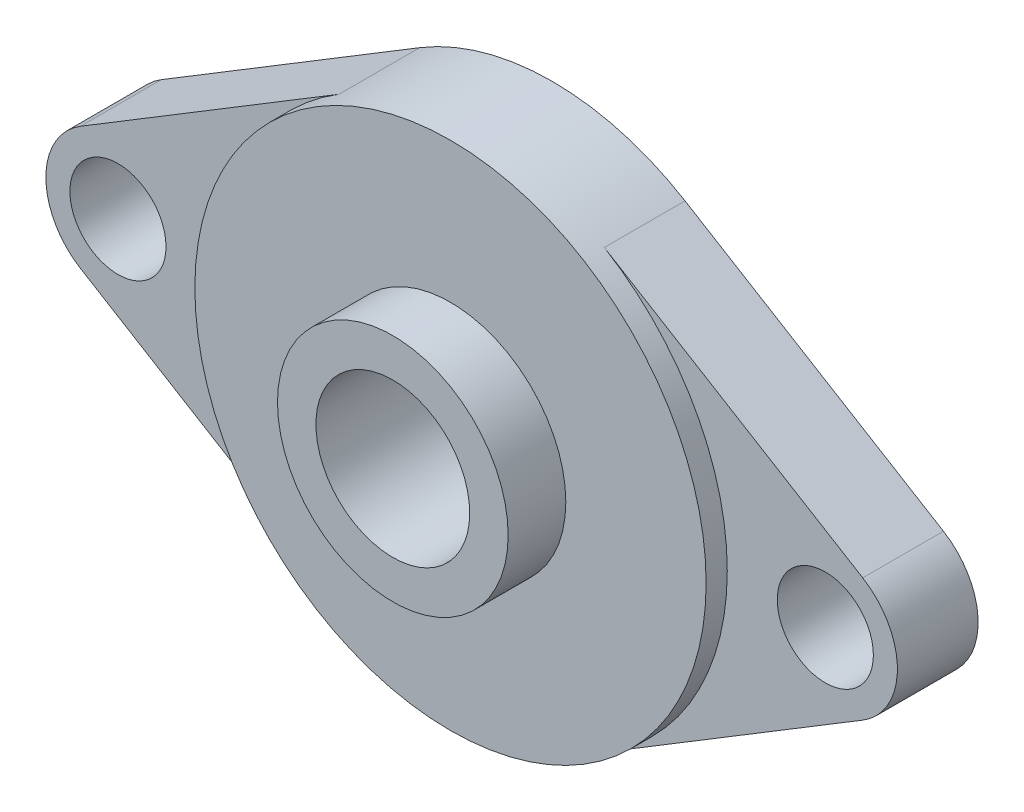
ISO-10303-21;
HEADER;
FILE_DESCRIPTION(('STEP AP214'),'2;1');
FILE_NAME('part.step','',(''),(''),'','','');
FILE_SCHEMA(('AUTOMOTIVE_DESIGN { 1 0 10303 214 1 1 1 1 }'));
ENDSEC;
DATA;
#1=APPLICATION_CONTEXT('core data for automotive mechanical design processes');
#2=APPLICATION_PROTOCOL_DEFINITION('international standard','automotive_design',2000,#1);
#3=PRODUCT_CONTEXT('',#1,'mechanical');
#4=PRODUCT('Part','Part','',(#3));
#5=PRODUCT_RELATED_PRODUCT_CATEGORY('part','',(#4));
#6=PRODUCT_DEFINITION_FORMATION('','',#4);
#7=PRODUCT_DEFINITION_CONTEXT('part definition',#1,'design');
#8=PRODUCT_DEFINITION('design','',#6,#7);
#9=PRODUCT_DEFINITION_SHAPE('','',#8);
#10=(LENGTH_UNIT() NAMED_UNIT(*) SI_UNIT(.MILLI.,.METRE.));
#11=(NAMED_UNIT(*) PLANE_ANGLE_UNIT() SI_UNIT($,.RADIAN.));
#12=(NAMED_UNIT(*) SI_UNIT($,.STERADIAN.) SOLID_ANGLE_UNIT());
#13=UNCERTAINTY_MEASURE_WITH_UNIT(LENGTH_MEASURE(1.E-05),#10,'distance_accuracy_value','');
#14=(GEOMETRIC_REPRESENTATION_CONTEXT(3) GLOBAL_UNCERTAINTY_ASSIGNED_CONTEXT((#13)) GLOBAL_UNIT_ASSIGNED_CONTEXT((#10,
#11,#12)) REPRESENTATION_CONTEXT('',''));
#15=CARTESIAN_POINT('',(0.,0.,0.));
#16=DIRECTION('',(0.,0.,1.));
#17=DIRECTION('',(1.,0.,0.));
#18=AXIS2_PLACEMENT_3D('',#15,#16,#17);
#19=CARTESIAN_POINT('',(0.,0.,4.2));
#20=DIRECTION('',(0.,0.,-1.));
#21=DIRECTION('',(-1.,0.,0.));
#22=AXIS2_PLACEMENT_3D('',#19,#20,#21);
#23=CYLINDRICAL_SURFACE('',#22,13.3);
#24=CARTESIAN_POINT('',(0.,0.,0.));
#25=DIRECTION('',(0.,0.,1.));
#26=DIRECTION('',(1.,0.,0.));
#27=AXIS2_PLACEMENT_3D('',#24,#25,#26);
#28=CIRCLE('',#27,13.3);
#29=CARTESIAN_POINT('',(6.90298913043478,11.3683218227274,0.));
#30=VERTEX_POINT('',#29);
#31=CARTESIAN_POINT('',(-6.90298913043478,11.3683218227274,0.));
#32=VERTEX_POINT('',#31);
#33=EDGE_CURVE('E84',#30,#32,#28,.T.);
#34=ORIENTED_EDGE('',*,*,#33,.T.);
#35=DIRECTION('',(0.,0.,-1.));
#36=VECTOR('',#35,1.);
#37=CARTESIAN_POINT('',(-6.90298913043478,11.3683218227274,4.2));
#38=LINE('',#37,#36);
#39=CARTESIAN_POINT('',(-6.90298913043478,11.3683218227274,4.2));
#40=VERTEX_POINT('',#39);
#41=EDGE_CURVE('E171',#40,#32,#38,.T.);
#42=ORIENTED_EDGE('',*,*,#41,.F.);
#43=CARTESIAN_POINT('',(0.,0.,4.2));
#44=DIRECTION('',(0.,0.,1.));
#45=DIRECTION('',(1.,0.,0.));
#46=AXIS2_PLACEMENT_3D('',#43,#44,#45);
#47=CIRCLE('',#46,13.3);
#48=CARTESIAN_POINT('',(-6.90298913043478,-11.3683218227274,4.2));
#49=VERTEX_POINT('',#48);
#50=EDGE_CURVE('E147',#49,#40,#47,.F.);
#51=ORIENTED_EDGE('',*,*,#50,.F.);
#52=DIRECTION('',(0.,0.,-1.));
#53=VECTOR('',#52,1.);
#54=CARTESIAN_POINT('',(-6.90298913043478,-11.3683218227274,4.2));
#55=LINE('',#54,#53);
#56=CARTESIAN_POINT('',(-6.90298913043478,-11.3683218227274,0.));
#57=VERTEX_POINT('',#56);
#58=EDGE_CURVE('E47',#49,#57,#55,.T.);
#59=ORIENTED_EDGE('',*,*,#58,.T.);
#60=CARTESIAN_POINT('',(6.90298913043478,-11.3683218227274,0.));
#61=VERTEX_POINT('',#60);
#62=EDGE_CURVE('E150',#57,#61,#28,.T.);
#63=ORIENTED_EDGE('',*,*,#62,.T.);
#64=DIRECTION('',(0.,0.,-1.));
#65=VECTOR('',#64,1.);
#66=CARTESIAN_POINT('',(6.90298913043478,-11.3683218227274,4.2));
#67=LINE('',#66,#65);
#68=CARTESIAN_POINT('',(6.90298913043478,-11.3683218227274,4.2));
#69=VERTEX_POINT('',#68);
#70=EDGE_CURVE('E126',#69,#61,#67,.T.);
#71=ORIENTED_EDGE('',*,*,#70,.F.);
#72=CARTESIAN_POINT('',(6.90298913043478,11.3683218227274,4.2));
#73=VERTEX_POINT('',#72);
#74=EDGE_CURVE('E112',#73,#69,#47,.F.);
#75=ORIENTED_EDGE('',*,*,#74,.F.);
#76=DIRECTION('',(0.,0.,-1.));
#77=VECTOR('',#76,1.);
#78=CARTESIAN_POINT('',(6.90298913043478,11.3683218227274,4.2));
#79=LINE('',#78,#77);
#80=EDGE_CURVE('E173',#73,#30,#79,.T.);
#81=ORIENTED_EDGE('',*,*,#80,.T.);
#82=EDGE_LOOP('',(#34,#42,#51,#59,#63,#71,#75,#81));
#83=FACE_BOUND('',#82,.T.);
#84=CARTESIAN_POINT('',(0.,0.,5.3));
#85=DIRECTION('',(0.,0.,1.));
#86=DIRECTION('',(1.,0.,0.));
#87=AXIS2_PLACEMENT_3D('',#84,#85,#86);
#88=CIRCLE('',#87,13.3);
#89=CARTESIAN_POINT('',(13.3,0.,5.3));
#90=VERTEX_POINT('',#89);
#91=EDGE_CURVE('E252',#90,#90,#88,.T.);
#92=ORIENTED_EDGE('',*,*,#91,.F.);
#93=EDGE_LOOP('',(#92));
#94=FACE_BOUND('',#93,.T.);
#95=ADVANCED_FACE('F38',(#83,#94),#23,.T.);
#96=CARTESIAN_POINT('',(0.,0.,8.3));
#97=DIRECTION('',(0.,0.,1.));
#98=DIRECTION('',(1.,0.,0.));
#99=AXIS2_PLACEMENT_3D('',#96,#97,#98);
#100=PLANE('',#99);
#101=CARTESIAN_POINT('',(0.,0.,8.3));
#102=DIRECTION('',(0.,0.,1.));
#103=DIRECTION('',(1.,0.,0.));
#104=AXIS2_PLACEMENT_3D('',#101,#102,#103);
#105=CIRCLE('',#104,4.);
#106=CARTESIAN_POINT('',(4.,0.,8.3));
#107=VERTEX_POINT('',#106);
#108=EDGE_CURVE('E196',#107,#107,#105,.T.);
#109=ORIENTED_EDGE('',*,*,#108,.F.);
#110=EDGE_LOOP('',(#109));
#111=FACE_BOUND('',#110,.T.);
#112=CARTESIAN_POINT('',(0.,0.,8.3));
#113=DIRECTION('',(0.,0.,1.));
#114=DIRECTION('',(1.,0.,0.));
#115=AXIS2_PLACEMENT_3D('',#112,#113,#114);
#116=CIRCLE('',#115,6.);
#117=CARTESIAN_POINT('',(6.,0.,8.3));
#118=VERTEX_POINT('',#117);
#119=EDGE_CURVE('E249',#118,#118,#116,.T.);
#120=ORIENTED_EDGE('',*,*,#119,.T.);
#121=EDGE_LOOP('',(#120));
#122=FACE_BOUND('',#121,.T.);
#123=ADVANCED_FACE('F213',(#111,#122),#100,.T.);
#124=CARTESIAN_POINT('',(0.,0.,4.2));
#125=DIRECTION('',(0.,0.,1.));
#126=DIRECTION('',(1.,0.,0.));
#127=AXIS2_PLACEMENT_3D('',#124,#125,#126);
#128=PLANE('',#127);
#129=CARTESIAN_POINT('',(-18.4,0.,4.2));
#130=DIRECTION('',(0.,0.,1.));
#131=DIRECTION('',(1.,0.,0.));
#132=AXIS2_PLACEMENT_3D('',#129,#130,#131);
#133=CIRCLE('',#132,2.5);
#134=CARTESIAN_POINT('',(-15.9,0.,4.2));
#135=VERTEX_POINT('',#134);
#136=EDGE_CURVE('E137',#135,#135,#133,.F.);
#137=ORIENTED_EDGE('',*,*,#136,.T.);
#138=EDGE_LOOP('',(#137));
#139=FACE_BOUND('',#138,.T.);
#140=DIRECTION('',(-0.85476103930281,0.519021739130434,0.));
#141=VECTOR('',#140,1.);
#142=CARTESIAN_POINT('',(-6.90298913043478,-11.3683218227274,4.2));
#143=LINE('',#142,#141);
#144=CARTESIAN_POINT('',(-20.3463315217391,-3.20535389738554,4.2));
#145=VERTEX_POINT('',#144);
#146=EDGE_CURVE('E116',#49,#145,#143,.T.);
#147=ORIENTED_EDGE('',*,*,#146,.F.);
#148=ORIENTED_EDGE('',*,*,#50,.T.);
#149=DIRECTION('',(-0.85476103930281,-0.519021739130434,0.));
#150=VECTOR('',#149,1.);
#151=CARTESIAN_POINT('',(-6.90298913043478,11.3683218227274,4.2));
#152=LINE('',#151,#150);
#153=CARTESIAN_POINT('',(-20.3463315217391,3.20535389738554,4.2));
#154=VERTEX_POINT('',#153);
#155=EDGE_CURVE('E55',#40,#154,#152,.T.);
#156=ORIENTED_EDGE('',*,*,#155,.T.);
#157=CARTESIAN_POINT('',(-18.4,0.,4.2));
#158=DIRECTION('',(0.,0.,1.));
#159=DIRECTION('',(1.,0.,0.));
#160=AXIS2_PLACEMENT_3D('',#157,#158,#159);
#161=CIRCLE('',#160,3.75);
#162=EDGE_CURVE('E169',#145,#154,#161,.F.);
#163=ORIENTED_EDGE('',*,*,#162,.F.);
#164=EDGE_LOOP('',(#147,#148,#156,#163));
#165=FACE_BOUND('',#164,.T.);
#166=ADVANCED_FACE('F217',(#139,#165),#128,.T.);
#167=CARTESIAN_POINT('',(-18.4,0.,4.2));
#168=DIRECTION('',(0.,0.,-1.));
#169=DIRECTION('',(-1.,0.,0.));
#170=AXIS2_PLACEMENT_3D('',#167,#168,#169);
#171=CYLINDRICAL_SURFACE('',#170,3.75);
#172=CARTESIAN_POINT('',(-18.4,0.,0.));
#173=DIRECTION('',(0.,0.,1.));
#174=DIRECTION('',(1.,0.,0.));
#175=AXIS2_PLACEMENT_3D('',#172,#173,#174);
#176=CIRCLE('',#175,3.75);
#177=CARTESIAN_POINT('',(-20.3463315217391,-3.20535389738554,0.));
#178=VERTEX_POINT('',#177);
#179=CARTESIAN_POINT('',(-20.3463315217391,3.20535389738554,0.));
#180=VERTEX_POINT('',#179);
#181=EDGE_CURVE('E143',#178,#180,#176,.F.);
#182=ORIENTED_EDGE('',*,*,#181,.F.);
#183=DIRECTION('',(0.,0.,-1.));
#184=VECTOR('',#183,1.);
#185=CARTESIAN_POINT('',(-20.3463315217391,-3.20535389738554,4.2));
#186=LINE('',#185,#184);
#187=EDGE_CURVE('E11',#145,#178,#186,.T.);
#188=ORIENTED_EDGE('',*,*,#187,.F.);
#189=ORIENTED_EDGE('',*,*,#162,.T.);
#190=DIRECTION('',(0.,0.,-1.));
#191=VECTOR('',#190,1.);
#192=CARTESIAN_POINT('',(-20.3463315217391,3.20535389738554,4.2));
#193=LINE('',#192,#191);
#194=EDGE_CURVE('E91',#154,#180,#193,.T.);
#195=ORIENTED_EDGE('',*,*,#194,.T.);
#196=EDGE_LOOP('',(#182,#188,#189,#195));
#197=FACE_BOUND('',#196,.T.);
#198=ADVANCED_FACE('F40',(#197),#171,.T.);
#199=CARTESIAN_POINT('',(-6.90298913043478,-11.3683218227274,4.2));
#200=DIRECTION('',(-0.519021739130434,-0.85476103930281,0.));
#201=DIRECTION('',(0.85476103930281,-0.519021739130434,0.));
#202=AXIS2_PLACEMENT_3D('',#199,#200,#201);
#203=PLANE('',#202);
#204=DIRECTION('',(-0.85476103930281,0.519021739130434,0.));
#205=VECTOR('',#204,1.);
#206=CARTESIAN_POINT('',(-6.90298913043478,-11.3683218227274,0.));
#207=LINE('',#206,#205);
#208=EDGE_CURVE('E146',#57,#178,#207,.T.);
#209=ORIENTED_EDGE('',*,*,#208,.F.);
#210=ORIENTED_EDGE('',*,*,#58,.F.);
#211=ORIENTED_EDGE('',*,*,#146,.T.);
#212=ORIENTED_EDGE('',*,*,#187,.T.);
#213=EDGE_LOOP('',(#209,#210,#211,#212));
#214=FACE_BOUND('',#213,.T.);
#215=ADVANCED_FACE('F187',(#214),#203,.T.);
#216=CARTESIAN_POINT('',(6.90298913043478,-11.3683218227274,4.2));
#217=DIRECTION('',(-0.519021739130435,0.85476103930281,0.));
#218=DIRECTION('',(-0.854761039302809,-0.519021739130435,0.));
#219=AXIS2_PLACEMENT_3D('',#216,#217,#218);
#220=PLANE('',#219);
#221=DIRECTION('',(0.85476103930281,0.519021739130435,0.));
#222=VECTOR('',#221,1.);
#223=CARTESIAN_POINT('',(6.90298913043478,-11.3683218227274,0.));
#224=LINE('',#223,#222);
#225=CARTESIAN_POINT('',(20.3463315217391,-3.20535389738553,0.));
#226=VERTEX_POINT('',#225);
#227=EDGE_CURVE('E122',#61,#226,#224,.T.);
#228=ORIENTED_EDGE('',*,*,#227,.T.);
#229=DIRECTION('',(0.,0.,-1.));
#230=VECTOR('',#229,1.);
#231=CARTESIAN_POINT('',(20.3463315217391,-3.20535389738553,4.2));
#232=LINE('',#231,#230);
#233=CARTESIAN_POINT('',(20.3463315217391,-3.20535389738553,4.2));
#234=VERTEX_POINT('',#233);
#235=EDGE_CURVE('E119',#234,#226,#232,.T.);
#236=ORIENTED_EDGE('',*,*,#235,.F.);
#237=DIRECTION('',(0.85476103930281,0.519021739130435,0.));
#238=VECTOR('',#237,1.);
#239=CARTESIAN_POINT('',(6.90298913043478,-11.3683218227274,4.2));
#240=LINE('',#239,#238);
#241=EDGE_CURVE('E103',#69,#234,#240,.T.);
#242=ORIENTED_EDGE('',*,*,#241,.F.);
#243=ORIENTED_EDGE('',*,*,#70,.T.);
#244=EDGE_LOOP('',(#228,#236,#242,#243));
#245=FACE_BOUND('',#244,.T.);
#246=ADVANCED_FACE('F120',(#245),#220,.F.);
#247=CARTESIAN_POINT('',(18.4,0.,4.2));
#248=DIRECTION('',(0.,0.,-1.));
#249=DIRECTION('',(-1.,0.,0.));
#250=AXIS2_PLACEMENT_3D('',#247,#248,#249);
#251=CYLINDRICAL_SURFACE('',#250,3.75);
#252=CARTESIAN_POINT('',(18.4,0.,0.));
#253=DIRECTION('',(0.,0.,1.));
#254=DIRECTION('',(1.,0.,0.));
#255=AXIS2_PLACEMENT_3D('',#252,#253,#254);
#256=CIRCLE('',#255,3.75);
#257=CARTESIAN_POINT('',(20.3463315217391,3.20535389738553,0.));
#258=VERTEX_POINT('',#257);
#259=EDGE_CURVE('E153',#226,#258,#256,.T.);
#260=ORIENTED_EDGE('',*,*,#259,.T.);
#261=DIRECTION('',(0.,0.,-1.));
#262=VECTOR('',#261,1.);
#263=CARTESIAN_POINT('',(20.3463315217391,3.20535389738553,4.2));
#264=LINE('',#263,#262);
#265=CARTESIAN_POINT('',(20.3463315217391,3.20535389738553,4.2));
#266=VERTEX_POINT('',#265);
#267=EDGE_CURVE('E127',#266,#258,#264,.T.);
#268=ORIENTED_EDGE('',*,*,#267,.F.);
#269=CARTESIAN_POINT('',(18.4,0.,4.2));
#270=DIRECTION('',(0.,0.,1.));
#271=DIRECTION('',(1.,0.,0.));
#272=AXIS2_PLACEMENT_3D('',#269,#270,#271);
#273=CIRCLE('',#272,3.75);
#274=EDGE_CURVE('E109',#234,#266,#273,.T.);
#275=ORIENTED_EDGE('',*,*,#274,.F.);
#276=ORIENTED_EDGE('',*,*,#235,.T.);
#277=EDGE_LOOP('',(#260,#268,#275,#276));
#278=FACE_BOUND('',#277,.T.);
#279=ADVANCED_FACE('F129',(#278),#251,.T.);
#280=CARTESIAN_POINT('',(6.90298913043478,11.3683218227274,4.2));
#281=DIRECTION('',(0.519021739130435,0.85476103930281,0.));
#282=DIRECTION('',(-0.854761039302809,0.519021739130435,0.));
#283=AXIS2_PLACEMENT_3D('',#280,#281,#282);
#284=PLANE('',#283);
#285=DIRECTION('',(0.85476103930281,-0.519021739130435,0.));
#286=VECTOR('',#285,1.);
#287=CARTESIAN_POINT('',(6.90298913043478,11.3683218227274,0.));
#288=LINE('',#287,#286);
#289=EDGE_CURVE('E155',#30,#258,#288,.T.);
#290=ORIENTED_EDGE('',*,*,#289,.F.);
#291=ORIENTED_EDGE('',*,*,#80,.F.);
#292=DIRECTION('',(0.85476103930281,-0.519021739130435,0.));
#293=VECTOR('',#292,1.);
#294=CARTESIAN_POINT('',(6.90298913043478,11.3683218227274,4.2));
#295=LINE('',#294,#293);
#296=EDGE_CURVE('E131',#73,#266,#295,.T.);
#297=ORIENTED_EDGE('',*,*,#296,.T.);
#298=ORIENTED_EDGE('',*,*,#267,.T.);
#299=EDGE_LOOP('',(#290,#291,#297,#298));
#300=FACE_BOUND('',#299,.T.);
#301=ADVANCED_FACE('F199',(#300),#284,.T.);
#302=CARTESIAN_POINT('',(0.,0.,4.2));
#303=DIRECTION('',(0.,0.,-1.));
#304=DIRECTION('',(-1.,0.,0.));
#305=AXIS2_PLACEMENT_3D('',#302,#303,#304);
#306=CYLINDRICAL_SURFACE('',#305,4.);
#307=CARTESIAN_POINT('',(0.,0.,0.));
#308=DIRECTION('',(0.,0.,1.));
#309=DIRECTION('',(1.,0.,0.));
#310=AXIS2_PLACEMENT_3D('',#307,#308,#309);
#311=CIRCLE('',#310,4.);
#312=CARTESIAN_POINT('',(4.,0.,0.));
#313=VERTEX_POINT('',#312);
#314=EDGE_CURVE('E163',#313,#313,#311,.T.);
#315=ORIENTED_EDGE('',*,*,#314,.F.);
#316=EDGE_LOOP('',(#315));
#317=FACE_BOUND('',#316,.T.);
#318=ORIENTED_EDGE('',*,*,#108,.T.);
#319=EDGE_LOOP('',(#318));
#320=FACE_BOUND('',#319,.T.);
#321=ADVANCED_FACE('F201',(#317,#320),#306,.F.);
#322=CARTESIAN_POINT('',(-18.4,0.,4.2));
#323=DIRECTION('',(0.,0.,-1.));
#324=DIRECTION('',(-1.,0.,0.));
#325=AXIS2_PLACEMENT_3D('',#322,#323,#324);
#326=CYLINDRICAL_SURFACE('',#325,2.5);
#327=ORIENTED_EDGE('',*,*,#136,.F.);
#328=EDGE_LOOP('',(#327));
#329=FACE_BOUND('',#328,.T.);
#330=CARTESIAN_POINT('',(-18.4,0.,0.));
#331=DIRECTION('',(0.,0.,1.));
#332=DIRECTION('',(1.,0.,0.));
#333=AXIS2_PLACEMENT_3D('',#330,#331,#332);
#334=CIRCLE('',#333,2.5);
#335=CARTESIAN_POINT('',(-15.9,0.,0.));
#336=VERTEX_POINT('',#335);
#337=EDGE_CURVE('E160',#336,#336,#334,.F.);
#338=ORIENTED_EDGE('',*,*,#337,.T.);
#339=EDGE_LOOP('',(#338));
#340=FACE_BOUND('',#339,.T.);
#341=ADVANCED_FACE('F207',(#329,#340),#326,.F.);
#342=CARTESIAN_POINT('',(-6.90298913043478,11.3683218227274,4.2));
#343=DIRECTION('',(0.519021739130434,-0.85476103930281,0.));
#344=DIRECTION('',(0.85476103930281,0.519021739130434,0.));
#345=AXIS2_PLACEMENT_3D('',#342,#343,#344);
#346=PLANE('',#345);
#347=DIRECTION('',(-0.85476103930281,-0.519021739130434,0.));
#348=VECTOR('',#347,1.);
#349=CARTESIAN_POINT('',(-6.90298913043478,11.3683218227274,0.));
#350=LINE('',#349,#348);
#351=EDGE_CURVE('E158',#32,#180,#350,.T.);
#352=ORIENTED_EDGE('',*,*,#351,.T.);
#353=ORIENTED_EDGE('',*,*,#194,.F.);
#354=ORIENTED_EDGE('',*,*,#155,.F.);
#355=ORIENTED_EDGE('',*,*,#41,.T.);
#356=EDGE_LOOP('',(#352,#353,#354,#355));
#357=FACE_BOUND('',#356,.T.);
#358=ADVANCED_FACE('F191',(#357),#346,.F.);
#359=CARTESIAN_POINT('',(18.4,0.,4.2));
#360=DIRECTION('',(0.,0.,-1.));
#361=DIRECTION('',(-1.,0.,0.));
#362=AXIS2_PLACEMENT_3D('',#359,#360,#361);
#363=CYLINDRICAL_SURFACE('',#362,2.5);
#364=CARTESIAN_POINT('',(18.4,0.,4.2));
#365=DIRECTION('',(0.,0.,1.));
#366=DIRECTION('',(1.,0.,0.));
#367=AXIS2_PLACEMENT_3D('',#364,#365,#366);
#368=CIRCLE('',#367,2.5);
#369=CARTESIAN_POINT('',(20.9,0.,4.2));
#370=VERTEX_POINT('',#369);
#371=EDGE_CURVE('E140',#370,#370,#368,.T.);
#372=ORIENTED_EDGE('',*,*,#371,.T.);
#373=EDGE_LOOP('',(#372));
#374=FACE_BOUND('',#373,.T.);
#375=CARTESIAN_POINT('',(18.4,0.,0.));
#376=DIRECTION('',(0.,0.,1.));
#377=DIRECTION('',(1.,0.,0.));
#378=AXIS2_PLACEMENT_3D('',#375,#376,#377);
#379=CIRCLE('',#378,2.5);
#380=CARTESIAN_POINT('',(20.9,0.,0.));
#381=VERTEX_POINT('',#380);
#382=EDGE_CURVE('E166',#381,#381,#379,.T.);
#383=ORIENTED_EDGE('',*,*,#382,.F.);
#384=EDGE_LOOP('',(#383));
#385=FACE_BOUND('',#384,.T.);
#386=ADVANCED_FACE('F223',(#374,#385),#363,.F.);
#387=ORIENTED_EDGE('',*,*,#296,.F.);
#388=ORIENTED_EDGE('',*,*,#74,.T.);
#389=ORIENTED_EDGE('',*,*,#241,.T.);
#390=ORIENTED_EDGE('',*,*,#274,.T.);
#391=EDGE_LOOP('',(#387,#388,#389,#390));
#392=FACE_BOUND('',#391,.T.);
#393=ORIENTED_EDGE('',*,*,#371,.F.);
#394=EDGE_LOOP('',(#393));
#395=FACE_BOUND('',#394,.T.);
#396=ADVANCED_FACE('F106',(#392,#395),#128,.T.);
#397=CARTESIAN_POINT('',(0.,0.,0.));
#398=DIRECTION('',(0.,0.,1.));
#399=DIRECTION('',(1.,0.,0.));
#400=AXIS2_PLACEMENT_3D('',#397,#398,#399);
#401=PLANE('',#400);
#402=ORIENTED_EDGE('',*,*,#227,.F.);
#403=ORIENTED_EDGE('',*,*,#62,.F.);
#404=ORIENTED_EDGE('',*,*,#208,.T.);
#405=ORIENTED_EDGE('',*,*,#181,.T.);
#406=ORIENTED_EDGE('',*,*,#351,.F.);
#407=ORIENTED_EDGE('',*,*,#33,.F.);
#408=ORIENTED_EDGE('',*,*,#289,.T.);
#409=ORIENTED_EDGE('',*,*,#259,.F.);
#410=EDGE_LOOP('',(#402,#403,#404,#405,#406,#407,#408,#409));
#411=FACE_BOUND('',#410,.T.);
#412=ORIENTED_EDGE('',*,*,#382,.T.);
#413=EDGE_LOOP('',(#412));
#414=FACE_BOUND('',#413,.T.);
#415=ORIENTED_EDGE('',*,*,#314,.T.);
#416=EDGE_LOOP('',(#415));
#417=FACE_BOUND('',#416,.T.);
#418=ORIENTED_EDGE('',*,*,#337,.F.);
#419=EDGE_LOOP('',(#418));
#420=FACE_BOUND('',#419,.T.);
#421=ADVANCED_FACE('F185',(#411,#414,#417,#420),#401,.F.);
#422=CARTESIAN_POINT('',(0.,0.,5.3));
#423=DIRECTION('',(0.,0.,1.));
#424=DIRECTION('',(1.,0.,0.));
#425=AXIS2_PLACEMENT_3D('',#422,#423,#424);
#426=PLANE('',#425);
#427=CARTESIAN_POINT('',(0.,0.,5.3));
#428=DIRECTION('',(0.,0.,1.));
#429=DIRECTION('',(1.,0.,0.));
#430=AXIS2_PLACEMENT_3D('',#427,#428,#429);
#431=CIRCLE('',#430,6.);
#432=CARTESIAN_POINT('',(6.,0.,5.3));
#433=VERTEX_POINT('',#432);
#434=EDGE_CURVE('E246',#433,#433,#431,.T.);
#435=ORIENTED_EDGE('',*,*,#434,.F.);
#436=EDGE_LOOP('',(#435));
#437=FACE_BOUND('',#436,.T.);
#438=ORIENTED_EDGE('',*,*,#91,.T.);
#439=EDGE_LOOP('',(#438));
#440=FACE_BOUND('',#439,.T.);
#441=ADVANCED_FACE('F232',(#437,#440),#426,.T.);
#442=CARTESIAN_POINT('',(0.,0.,5.3));
#443=DIRECTION('',(0.,0.,1.));
#444=DIRECTION('',(1.,0.,0.));
#445=AXIS2_PLACEMENT_3D('',#442,#443,#444);
#446=CYLINDRICAL_SURFACE('',#445,6.);
#447=ORIENTED_EDGE('',*,*,#434,.T.);
#448=EDGE_LOOP('',(#447));
#449=FACE_BOUND('',#448,.T.);
#450=ORIENTED_EDGE('',*,*,#119,.F.);
#451=EDGE_LOOP('',(#450));
#452=FACE_BOUND('',#451,.T.);
#453=ADVANCED_FACE('F237',(#449,#452),#446,.T.);
#454=CLOSED_SHELL('',(#95,#123,#166,#198,#215,#246,#279,#301,#321,#341,#358,#386,#396,#421,#441,#453));
#455=MANIFOLD_SOLID_BREP('B2',#454);
#456=ADVANCED_BREP_SHAPE_REPRESENTATION('',(#18,#455),#14);
#457=SHAPE_DEFINITION_REPRESENTATION(#9,#456);
ENDSEC;
END-ISO-10303-21;
